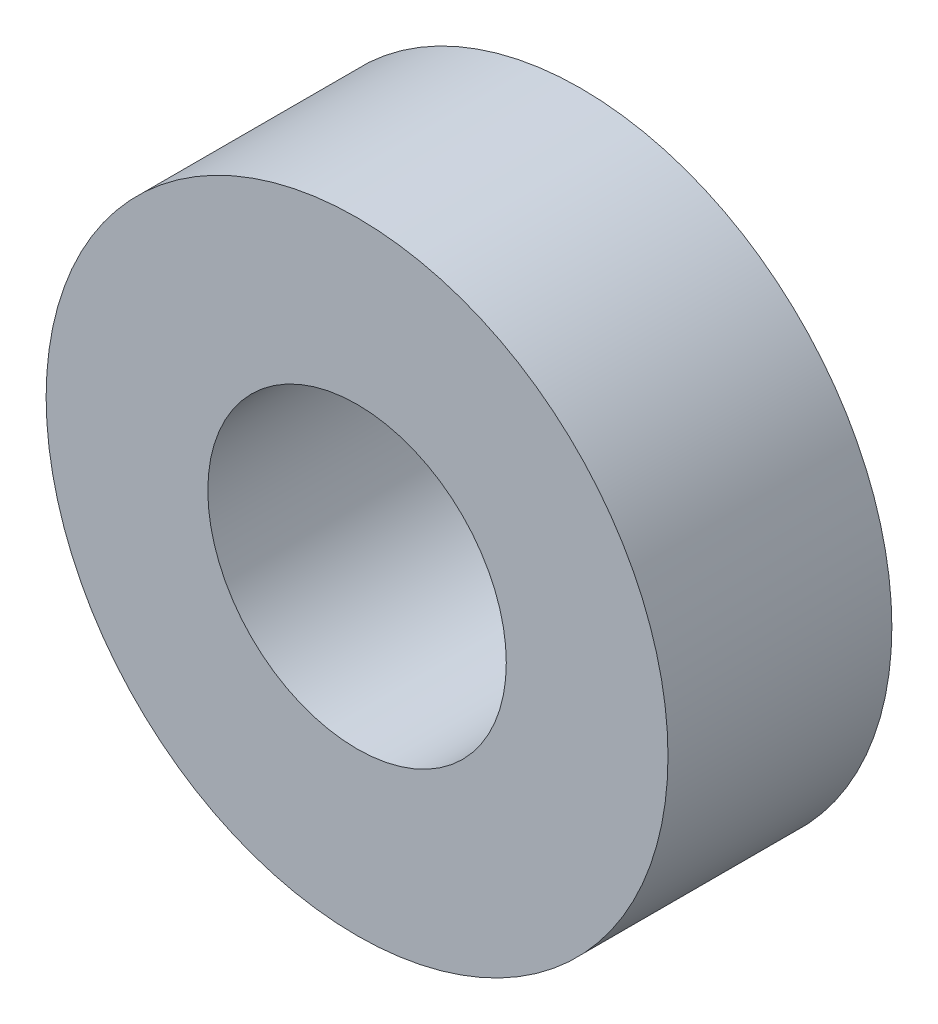
ISO-10303-21;
HEADER;
FILE_DESCRIPTION(('STEP AP214'),'2;1');
FILE_NAME('part.step','',(''),(''),'','','');
FILE_SCHEMA(('AUTOMOTIVE_DESIGN { 1 0 10303 214 1 1 1 1 }'));
ENDSEC;
DATA;
#1=APPLICATION_CONTEXT('core data for automotive mechanical design processes');
#2=APPLICATION_PROTOCOL_DEFINITION('international standard','automotive_design',2000,#1);
#3=PRODUCT_CONTEXT('',#1,'mechanical');
#4=PRODUCT('Part','Part','',(#3));
#5=PRODUCT_RELATED_PRODUCT_CATEGORY('part','',(#4));
#6=PRODUCT_DEFINITION_FORMATION('','',#4);
#7=PRODUCT_DEFINITION_CONTEXT('part definition',#1,'design');
#8=PRODUCT_DEFINITION('design','',#6,#7);
#9=PRODUCT_DEFINITION_SHAPE('','',#8);
#10=(LENGTH_UNIT() NAMED_UNIT(*) SI_UNIT(.MILLI.,.METRE.));
#11=(NAMED_UNIT(*) PLANE_ANGLE_UNIT() SI_UNIT($,.RADIAN.));
#12=(NAMED_UNIT(*) SI_UNIT($,.STERADIAN.) SOLID_ANGLE_UNIT());
#13=UNCERTAINTY_MEASURE_WITH_UNIT(LENGTH_MEASURE(1.E-05),#10,'distance_accuracy_value','');
#14=(GEOMETRIC_REPRESENTATION_CONTEXT(3) GLOBAL_UNCERTAINTY_ASSIGNED_CONTEXT((#13)) GLOBAL_UNIT_ASSIGNED_CONTEXT((#10,
#11,#12)) REPRESENTATION_CONTEXT('',''));
#15=CARTESIAN_POINT('',(0.,0.,0.));
#16=DIRECTION('',(0.,0.,1.));
#17=DIRECTION('',(1.,0.,0.));
#18=AXIS2_PLACEMENT_3D('',#15,#16,#17);
#19=CARTESIAN_POINT('',(0.,0.,4.5));
#20=DIRECTION('',(0.,0.,1.));
#21=DIRECTION('',(1.,0.,0.));
#22=AXIS2_PLACEMENT_3D('',#19,#20,#21);
#23=PLANE('',#22);
#24=CARTESIAN_POINT('',(0.,0.,4.5));
#25=DIRECTION('',(0.,0.,1.));
#26=DIRECTION('',(1.,0.,0.));
#27=AXIS2_PLACEMENT_3D('',#24,#25,#26);
#28=CIRCLE('',#27,6.25);
#29=CARTESIAN_POINT('',(6.25,0.,4.5));
#30=VERTEX_POINT('',#29);
#31=EDGE_CURVE('E10',#30,#30,#28,.T.);
#32=ORIENTED_EDGE('',*,*,#31,.T.);
#33=EDGE_LOOP('',(#32));
#34=FACE_BOUND('',#33,.T.);
#35=CARTESIAN_POINT('',(0.,0.,4.5));
#36=DIRECTION('',(0.,0.,1.));
#37=DIRECTION('',(1.,0.,0.));
#38=AXIS2_PLACEMENT_3D('',#35,#36,#37);
#39=CIRCLE('',#38,3.);
#40=CARTESIAN_POINT('',(3.,0.,4.5));
#41=VERTEX_POINT('',#40);
#42=EDGE_CURVE('E41',#41,#41,#39,.T.);
#43=ORIENTED_EDGE('',*,*,#42,.F.);
#44=EDGE_LOOP('',(#43));
#45=FACE_BOUND('',#44,.T.);
#46=ADVANCED_FACE('F30',(#34,#45),#23,.T.);
#47=CARTESIAN_POINT('',(0.,0.,0.));
#48=DIRECTION('',(0.,0.,1.));
#49=DIRECTION('',(1.,0.,0.));
#50=AXIS2_PLACEMENT_3D('',#47,#48,#49);
#51=PLANE('',#50);
#52=CARTESIAN_POINT('',(0.,0.,0.));
#53=DIRECTION('',(0.,0.,1.));
#54=DIRECTION('',(1.,0.,0.));
#55=AXIS2_PLACEMENT_3D('',#52,#53,#54);
#56=CIRCLE('',#55,6.25);
#57=CARTESIAN_POINT('',(6.25,0.,0.));
#58=VERTEX_POINT('',#57);
#59=EDGE_CURVE('E34',#58,#58,#56,.T.);
#60=ORIENTED_EDGE('',*,*,#59,.F.);
#61=EDGE_LOOP('',(#60));
#62=FACE_BOUND('',#61,.T.);
#63=CARTESIAN_POINT('',(0.,0.,0.));
#64=DIRECTION('',(0.,0.,1.));
#65=DIRECTION('',(1.,0.,0.));
#66=AXIS2_PLACEMENT_3D('',#63,#64,#65);
#67=CIRCLE('',#66,3.);
#68=CARTESIAN_POINT('',(3.,0.,0.));
#69=VERTEX_POINT('',#68);
#70=EDGE_CURVE('E43',#69,#69,#67,.T.);
#71=ORIENTED_EDGE('',*,*,#70,.T.);
#72=EDGE_LOOP('',(#71));
#73=FACE_BOUND('',#72,.T.);
#74=ADVANCED_FACE('F53',(#62,#73),#51,.F.);
#75=CARTESIAN_POINT('',(0.,0.,4.5));
#76=DIRECTION('',(0.,0.,-1.));
#77=DIRECTION('',(-1.,0.,0.));
#78=AXIS2_PLACEMENT_3D('',#75,#76,#77);
#79=CYLINDRICAL_SURFACE('',#78,6.25);
#80=ORIENTED_EDGE('',*,*,#31,.F.);
#81=EDGE_LOOP('',(#80));
#82=FACE_BOUND('',#81,.T.);
#83=ORIENTED_EDGE('',*,*,#59,.T.);
#84=EDGE_LOOP('',(#83));
#85=FACE_BOUND('',#84,.T.);
#86=ADVANCED_FACE('F32',(#82,#85),#79,.T.);
#87=CARTESIAN_POINT('',(0.,0.,4.5));
#88=DIRECTION('',(0.,0.,-1.));
#89=DIRECTION('',(-1.,0.,0.));
#90=AXIS2_PLACEMENT_3D('',#87,#88,#89);
#91=CYLINDRICAL_SURFACE('',#90,3.);
#92=ORIENTED_EDGE('',*,*,#42,.T.);
#93=EDGE_LOOP('',(#92));
#94=FACE_BOUND('',#93,.T.);
#95=ORIENTED_EDGE('',*,*,#70,.F.);
#96=EDGE_LOOP('',(#95));
#97=FACE_BOUND('',#96,.T.);
#98=ADVANCED_FACE('F49',(#94,#97),#91,.F.);
#99=CLOSED_SHELL('',(#46,#74,#86,#98));
#100=MANIFOLD_SOLID_BREP('B2',#99);
#101=ADVANCED_BREP_SHAPE_REPRESENTATION('',(#18,#100),#14);
#102=SHAPE_DEFINITION_REPRESENTATION(#9,#101);
ENDSEC;
END-ISO-10303-21;
